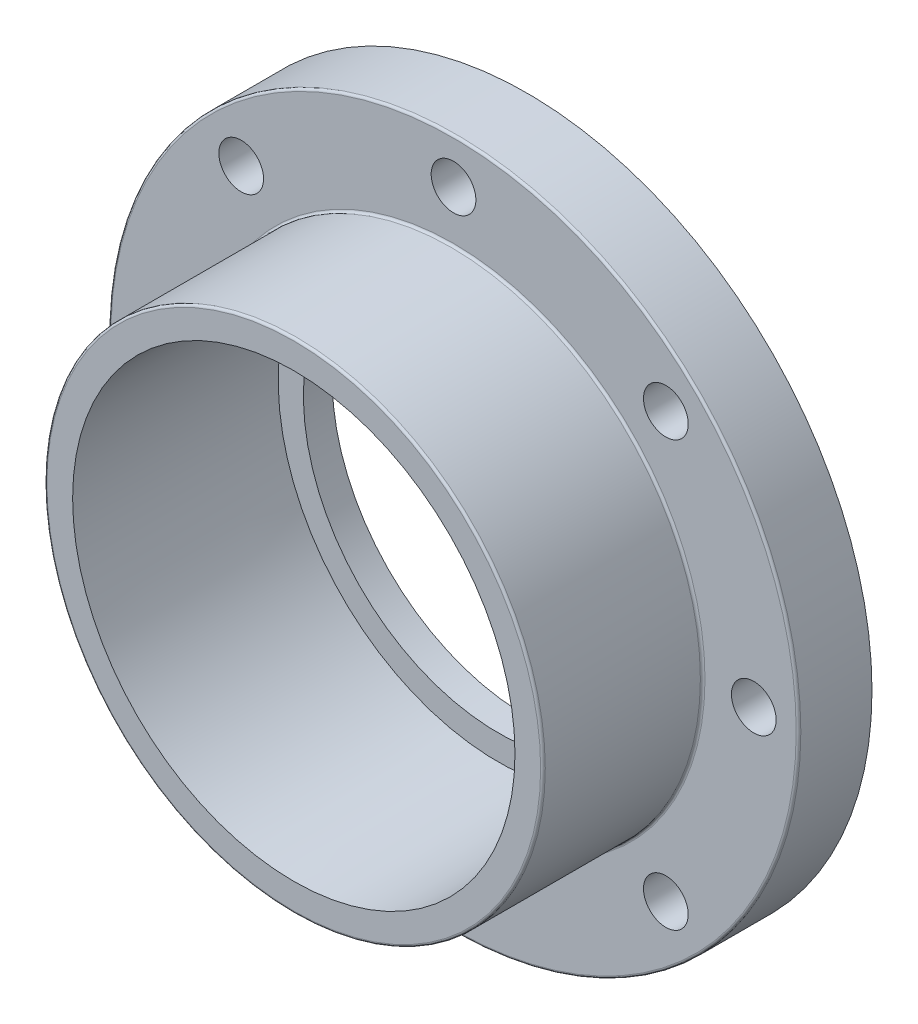
ISO-10303-21;
HEADER;
FILE_DESCRIPTION(('STEP AP214'),'2;1');
FILE_NAME('part.step','',(''),(''),'','','');
FILE_SCHEMA(('AUTOMOTIVE_DESIGN { 1 0 10303 214 1 1 1 1 }'));
ENDSEC;
DATA;
#1=APPLICATION_CONTEXT('core data for automotive mechanical design processes');
#2=APPLICATION_PROTOCOL_DEFINITION('international standard','automotive_design',2000,#1);
#3=PRODUCT_CONTEXT('',#1,'mechanical');
#4=PRODUCT('Part','Part','',(#3));
#5=PRODUCT_RELATED_PRODUCT_CATEGORY('part','',(#4));
#6=PRODUCT_DEFINITION_FORMATION('','',#4);
#7=PRODUCT_DEFINITION_CONTEXT('part definition',#1,'design');
#8=PRODUCT_DEFINITION('design','',#6,#7);
#9=PRODUCT_DEFINITION_SHAPE('','',#8);
#10=(LENGTH_UNIT() NAMED_UNIT(*) SI_UNIT(.MILLI.,.METRE.));
#11=(NAMED_UNIT(*) PLANE_ANGLE_UNIT() SI_UNIT($,.RADIAN.));
#12=(NAMED_UNIT(*) SI_UNIT($,.STERADIAN.) SOLID_ANGLE_UNIT());
#13=UNCERTAINTY_MEASURE_WITH_UNIT(LENGTH_MEASURE(1.E-05),#10,'distance_accuracy_value','');
#14=(GEOMETRIC_REPRESENTATION_CONTEXT(3) GLOBAL_UNCERTAINTY_ASSIGNED_CONTEXT((#13)) GLOBAL_UNIT_ASSIGNED_CONTEXT((#10,
#11,#12)) REPRESENTATION_CONTEXT('',''));
#15=CARTESIAN_POINT('',(0.,0.,0.));
#16=DIRECTION('',(0.,0.,1.));
#17=DIRECTION('',(1.,0.,0.));
#18=AXIS2_PLACEMENT_3D('',#15,#16,#17);
#19=CARTESIAN_POINT('',(0.,0.,36.5125));
#20=DIRECTION('',(0.,0.,1.));
#21=DIRECTION('',(1.,0.,0.));
#22=AXIS2_PLACEMENT_3D('',#19,#20,#21);
#23=PLANE('',#22);
#24=CARTESIAN_POINT('',(0.,0.,36.5125));
#25=DIRECTION('',(0.,0.,1.));
#26=DIRECTION('',(1.,0.,0.));
#27=AXIS2_PLACEMENT_3D('',#24,#25,#26);
#28=CIRCLE('',#27,124.979545454545);
#29=CARTESIAN_POINT('',(124.979545454545,0.,36.5125));
#30=VERTEX_POINT('',#29);
#31=EDGE_CURVE('E41',#30,#30,#28,.F.);
#32=ORIENTED_EDGE('',*,*,#31,.T.);
#33=EDGE_LOOP('',(#32));
#34=FACE_BOUND('',#33,.T.);
#35=CARTESIAN_POINT('',(0.,0.,36.5125));
#36=DIRECTION('',(0.,0.,1.));
#37=DIRECTION('',(1.,0.,0.));
#38=AXIS2_PLACEMENT_3D('',#35,#36,#37);
#39=CIRCLE('',#38,170.295454545455);
#40=CARTESIAN_POINT('',(170.295454545455,0.,36.5125));
#41=VERTEX_POINT('',#40);
#42=EDGE_CURVE('E45',#41,#41,#39,.T.);
#43=ORIENTED_EDGE('',*,*,#42,.T.);
#44=EDGE_LOOP('',(#43));
#45=FACE_BOUND('',#44,.T.);
#46=CARTESIAN_POINT('',(105.518009422561,105.518009422564,36.5125));
#47=DIRECTION('',(0.,0.,1.));
#48=DIRECTION('',(0.707106781186556,-0.707106781186539,0.));
#49=AXIS2_PLACEMENT_3D('',#46,#47,#48);
#50=CIRCLE('',#49,11.1125);
#51=CARTESIAN_POINT('',(113.375733528497,97.6602853166284,36.5125));
#52=VERTEX_POINT('',#51);
#53=EDGE_CURVE('E106',#52,#52,#50,.T.);
#54=ORIENTED_EDGE('',*,*,#53,.F.);
#55=EDGE_LOOP('',(#54));
#56=FACE_BOUND('',#55,.T.);
#57=CARTESIAN_POINT('',(149.225,1.5630489083666E-12,36.5125));
#58=DIRECTION('',(0.,0.,1.));
#59=DIRECTION('',(0.,-1.,0.));
#60=AXIS2_PLACEMENT_3D('',#57,#58,#59);
#61=CIRCLE('',#60,11.1125);
#62=CARTESIAN_POINT('',(149.225,-11.1124999999984,36.5125));
#63=VERTEX_POINT('',#62);
#64=EDGE_CURVE('E100',#63,#63,#61,.T.);
#65=ORIENTED_EDGE('',*,*,#64,.F.);
#66=EDGE_LOOP('',(#65));
#67=FACE_BOUND('',#66,.T.);
#68=CARTESIAN_POINT('',(105.518009422563,-105.518009422562,36.5125));
#69=DIRECTION('',(0.,0.,1.));
#70=DIRECTION('',(-0.707106781186541,-0.707106781186554,0.));
#71=AXIS2_PLACEMENT_3D('',#68,#69,#70);
#72=CIRCLE('',#71,11.1125);
#73=CARTESIAN_POINT('',(97.660285316628,-113.375733528497,36.5125));
#74=VERTEX_POINT('',#73);
#75=EDGE_CURVE('E94',#74,#74,#72,.T.);
#76=ORIENTED_EDGE('',*,*,#75,.F.);
#77=EDGE_LOOP('',(#76));
#78=FACE_BOUND('',#77,.T.);
#79=CARTESIAN_POINT('',(1.04203260557773E-12,-149.225,36.5125));
#80=DIRECTION('',(0.,0.,1.));
#81=DIRECTION('',(-1.,0.,0.));
#82=AXIS2_PLACEMENT_3D('',#79,#80,#81);
#83=CIRCLE('',#82,11.1125);
#84=CARTESIAN_POINT('',(-11.112499999999,-149.225,36.5125));
#85=VERTEX_POINT('',#84);
#86=EDGE_CURVE('E88',#85,#85,#83,.T.);
#87=ORIENTED_EDGE('',*,*,#86,.F.);
#88=EDGE_LOOP('',(#87));
#89=FACE_BOUND('',#88,.T.);
#90=CARTESIAN_POINT('',(-105.518009422562,-105.518009422563,36.5125));
#91=DIRECTION('',(0.,0.,1.));
#92=DIRECTION('',(-0.707106781186551,0.707106781186544,0.));
#93=AXIS2_PLACEMENT_3D('',#90,#91,#92);
#94=CIRCLE('',#93,11.1125);
#95=CARTESIAN_POINT('',(-113.375733528498,-97.6602853166276,36.5125));
#96=VERTEX_POINT('',#95);
#97=EDGE_CURVE('E82',#96,#96,#94,.T.);
#98=ORIENTED_EDGE('',*,*,#97,.F.);
#99=EDGE_LOOP('',(#98));
#100=FACE_BOUND('',#99,.T.);
#101=CARTESIAN_POINT('',(-149.225,-5.21016302788867E-13,36.5125));
#102=DIRECTION('',(0.,0.,1.));
#103=DIRECTION('',(0.,1.,0.));
#104=AXIS2_PLACEMENT_3D('',#101,#102,#103);
#105=CIRCLE('',#104,11.1125);
#106=CARTESIAN_POINT('',(-149.225,11.1124999999995,36.5125));
#107=VERTEX_POINT('',#106);
#108=EDGE_CURVE('E76',#107,#107,#105,.T.);
#109=ORIENTED_EDGE('',*,*,#108,.F.);
#110=EDGE_LOOP('',(#109));
#111=FACE_BOUND('',#110,.T.);
#112=CARTESIAN_POINT('',(-105.518009422563,105.518009422562,36.5125));
#113=DIRECTION('',(0.,0.,1.));
#114=DIRECTION('',(0.707106781186546,0.707106781186549,0.));
#115=AXIS2_PLACEMENT_3D('',#112,#113,#114);
#116=CIRCLE('',#115,11.1125);
#117=CARTESIAN_POINT('',(-97.6602853166273,113.375733528498,36.5125));
#118=VERTEX_POINT('',#117);
#119=EDGE_CURVE('E70',#118,#118,#116,.T.);
#120=ORIENTED_EDGE('',*,*,#119,.F.);
#121=EDGE_LOOP('',(#120));
#122=FACE_BOUND('',#121,.T.);
#123=CARTESIAN_POINT('',(0.,149.225,36.5125));
#124=DIRECTION('',(0.,0.,1.));
#125=DIRECTION('',(1.,0.,0.));
#126=AXIS2_PLACEMENT_3D('',#123,#124,#125);
#127=CIRCLE('',#126,11.1125);
#128=CARTESIAN_POINT('',(11.1125,149.225,36.5125));
#129=VERTEX_POINT('',#128);
#130=EDGE_CURVE('E64',#129,#129,#127,.T.);
#131=ORIENTED_EDGE('',*,*,#130,.F.);
#132=EDGE_LOOP('',(#131));
#133=FACE_BOUND('',#132,.T.);
#134=ADVANCED_FACE('F34',(#34,#45,#56,#67,#78,#89,#100,#111,#122,#133),#23,.T.);
#135=CARTESIAN_POINT('',(0.,0.,36.5125));
#136=DIRECTION('',(0.,0.,-1.));
#137=DIRECTION('',(-1.,0.,0.));
#138=AXIS2_PLACEMENT_3D('',#135,#136,#137);
#139=CYLINDRICAL_SURFACE('',#138,171.45);
#140=CARTESIAN_POINT('',(0.,0.,35.3579545454545));
#141=DIRECTION('',(0.,0.,1.));
#142=DIRECTION('',(1.,0.,0.));
#143=AXIS2_PLACEMENT_3D('',#140,#141,#142);
#144=CIRCLE('',#143,171.45);
#145=CARTESIAN_POINT('',(171.45,0.,35.3579545454545));
#146=VERTEX_POINT('',#145);
#147=EDGE_CURVE('E10',#146,#146,#144,.F.);
#148=ORIENTED_EDGE('',*,*,#147,.T.);
#149=EDGE_LOOP('',(#148));
#150=FACE_BOUND('',#149,.T.);
#151=CARTESIAN_POINT('',(0.,0.,0.));
#152=DIRECTION('',(0.,0.,1.));
#153=DIRECTION('',(1.,0.,0.));
#154=AXIS2_PLACEMENT_3D('',#151,#152,#153);
#155=CIRCLE('',#154,171.45);
#156=CARTESIAN_POINT('',(171.45,0.,0.));
#157=VERTEX_POINT('',#156);
#158=EDGE_CURVE('E60',#157,#157,#155,.T.);
#159=ORIENTED_EDGE('',*,*,#158,.T.);
#160=EDGE_LOOP('',(#159));
#161=FACE_BOUND('',#160,.T.);
#162=ADVANCED_FACE('F130',(#150,#161),#139,.T.);
#163=CARTESIAN_POINT('',(0.,0.,0.));
#164=DIRECTION('',(0.,0.,1.));
#165=DIRECTION('',(1.,0.,0.));
#166=AXIS2_PLACEMENT_3D('',#163,#164,#165);
#167=PLANE('',#166);
#168=CARTESIAN_POINT('',(0.,0.,0.));
#169=DIRECTION('',(0.,0.,-1.));
#170=DIRECTION('',(0.,1.,0.));
#171=AXIS2_PLACEMENT_3D('',#168,#169,#170);
#172=CIRCLE('',#171,96.8375);
#173=CARTESIAN_POINT('',(0.,96.8375,0.));
#174=VERTEX_POINT('',#173);
#175=EDGE_CURVE('E120',#174,#174,#172,.T.);
#176=ORIENTED_EDGE('',*,*,#175,.F.);
#177=EDGE_LOOP('',(#176));
#178=FACE_BOUND('',#177,.T.);
#179=CARTESIAN_POINT('',(105.518009422561,105.518009422564,0.));
#180=DIRECTION('',(0.,0.,1.));
#181=DIRECTION('',(0.707106781186556,-0.707106781186539,0.));
#182=AXIS2_PLACEMENT_3D('',#179,#180,#181);
#183=CIRCLE('',#182,11.1125);
#184=CARTESIAN_POINT('',(113.375733528497,97.6602853166284,0.));
#185=VERTEX_POINT('',#184);
#186=EDGE_CURVE('E103',#185,#185,#183,.T.);
#187=ORIENTED_EDGE('',*,*,#186,.T.);
#188=EDGE_LOOP('',(#187));
#189=FACE_BOUND('',#188,.T.);
#190=CARTESIAN_POINT('',(149.225,1.5630489083666E-12,0.));
#191=DIRECTION('',(0.,0.,1.));
#192=DIRECTION('',(0.,-1.,0.));
#193=AXIS2_PLACEMENT_3D('',#190,#191,#192);
#194=CIRCLE('',#193,11.1125);
#195=CARTESIAN_POINT('',(149.225,-11.1124999999984,0.));
#196=VERTEX_POINT('',#195);
#197=EDGE_CURVE('E97',#196,#196,#194,.T.);
#198=ORIENTED_EDGE('',*,*,#197,.T.);
#199=EDGE_LOOP('',(#198));
#200=FACE_BOUND('',#199,.T.);
#201=CARTESIAN_POINT('',(105.518009422563,-105.518009422562,0.));
#202=DIRECTION('',(0.,0.,1.));
#203=DIRECTION('',(-0.707106781186541,-0.707106781186554,0.));
#204=AXIS2_PLACEMENT_3D('',#201,#202,#203);
#205=CIRCLE('',#204,11.1125);
#206=CARTESIAN_POINT('',(97.660285316628,-113.375733528497,0.));
#207=VERTEX_POINT('',#206);
#208=EDGE_CURVE('E91',#207,#207,#205,.T.);
#209=ORIENTED_EDGE('',*,*,#208,.T.);
#210=EDGE_LOOP('',(#209));
#211=FACE_BOUND('',#210,.T.);
#212=CARTESIAN_POINT('',(1.04203260557773E-12,-149.225,0.));
#213=DIRECTION('',(0.,0.,1.));
#214=DIRECTION('',(-1.,0.,0.));
#215=AXIS2_PLACEMENT_3D('',#212,#213,#214);
#216=CIRCLE('',#215,11.1125);
#217=CARTESIAN_POINT('',(-11.112499999999,-149.225,0.));
#218=VERTEX_POINT('',#217);
#219=EDGE_CURVE('E85',#218,#218,#216,.T.);
#220=ORIENTED_EDGE('',*,*,#219,.T.);
#221=EDGE_LOOP('',(#220));
#222=FACE_BOUND('',#221,.T.);
#223=CARTESIAN_POINT('',(-105.518009422562,-105.518009422563,0.));
#224=DIRECTION('',(0.,0.,1.));
#225=DIRECTION('',(-0.707106781186551,0.707106781186544,0.));
#226=AXIS2_PLACEMENT_3D('',#223,#224,#225);
#227=CIRCLE('',#226,11.1125);
#228=CARTESIAN_POINT('',(-113.375733528498,-97.6602853166276,0.));
#229=VERTEX_POINT('',#228);
#230=EDGE_CURVE('E79',#229,#229,#227,.T.);
#231=ORIENTED_EDGE('',*,*,#230,.T.);
#232=EDGE_LOOP('',(#231));
#233=FACE_BOUND('',#232,.T.);
#234=CARTESIAN_POINT('',(-149.225,-5.21016302788867E-13,0.));
#235=DIRECTION('',(0.,0.,1.));
#236=DIRECTION('',(0.,1.,0.));
#237=AXIS2_PLACEMENT_3D('',#234,#235,#236);
#238=CIRCLE('',#237,11.1125);
#239=CARTESIAN_POINT('',(-149.225,11.1124999999995,0.));
#240=VERTEX_POINT('',#239);
#241=EDGE_CURVE('E73',#240,#240,#238,.T.);
#242=ORIENTED_EDGE('',*,*,#241,.T.);
#243=EDGE_LOOP('',(#242));
#244=FACE_BOUND('',#243,.T.);
#245=CARTESIAN_POINT('',(-105.518009422563,105.518009422562,0.));
#246=DIRECTION('',(0.,0.,1.));
#247=DIRECTION('',(0.707106781186546,0.707106781186549,0.));
#248=AXIS2_PLACEMENT_3D('',#245,#246,#247);
#249=CIRCLE('',#248,11.1125);
#250=CARTESIAN_POINT('',(-97.6602853166273,113.375733528498,0.));
#251=VERTEX_POINT('',#250);
#252=EDGE_CURVE('E67',#251,#251,#249,.T.);
#253=ORIENTED_EDGE('',*,*,#252,.T.);
#254=EDGE_LOOP('',(#253));
#255=FACE_BOUND('',#254,.T.);
#256=CARTESIAN_POINT('',(0.,149.225,0.));
#257=DIRECTION('',(0.,0.,1.));
#258=DIRECTION('',(1.,0.,0.));
#259=AXIS2_PLACEMENT_3D('',#256,#257,#258);
#260=CIRCLE('',#259,11.1125);
#261=CARTESIAN_POINT('',(11.1125,149.225,0.));
#262=VERTEX_POINT('',#261);
#263=EDGE_CURVE('E63',#262,#262,#260,.T.);
#264=ORIENTED_EDGE('',*,*,#263,.T.);
#265=EDGE_LOOP('',(#264));
#266=FACE_BOUND('',#265,.T.);
#267=ORIENTED_EDGE('',*,*,#158,.F.);
#268=EDGE_LOOP('',(#267));
#269=FACE_BOUND('',#268,.T.);
#270=ADVANCED_FACE('F126',(#178,#189,#200,#211,#222,#233,#244,#255,#266,#269),#167,.F.);
#271=CARTESIAN_POINT('',(0.,0.,115.8875));
#272=DIRECTION('',(0.,0.,-1.));
#273=DIRECTION('',(-1.,0.,0.));
#274=AXIS2_PLACEMENT_3D('',#271,#272,#273);
#275=CYLINDRICAL_SURFACE('',#274,123.825);
#276=CARTESIAN_POINT('',(0.,0.,114.732954545455));
#277=DIRECTION('',(0.,0.,1.));
#278=DIRECTION('',(1.,0.,0.));
#279=AXIS2_PLACEMENT_3D('',#276,#277,#278);
#280=CIRCLE('',#279,123.825);
#281=CARTESIAN_POINT('',(-123.825,0.,114.732954545455));
#282=VERTEX_POINT('',#281);
#283=EDGE_CURVE('E49',#282,#282,#280,.F.);
#284=CARTESIAN_POINT('',(0.,0.,37.6670454545455));
#285=DIRECTION('',(0.,0.,1.));
#286=DIRECTION('',(1.,0.,0.));
#287=AXIS2_PLACEMENT_3D('',#284,#285,#286);
#288=CIRCLE('',#287,123.825);
#289=CARTESIAN_POINT('',(-123.825,0.,37.6670454545455));
#290=VERTEX_POINT('',#289);
#291=EDGE_CURVE('E54',#290,#290,#288,.T.);
#292=CARTESIAN_POINT('',(-123.825,0.,114.732954545455));
#293=CARTESIAN_POINT('',(-123.825,0.,113.930184659091));
#294=CARTESIAN_POINT('',(-123.825,0.,113.127414772727));
#295=CARTESIAN_POINT('',(-123.825,0.,111.521875));
#296=CARTESIAN_POINT('',(-123.825,0.,110.719105113636));
#297=CARTESIAN_POINT('',(-123.825,0.,109.113565340909));
#298=CARTESIAN_POINT('',(-123.825,0.,108.310795454545));
#299=CARTESIAN_POINT('',(-123.825,0.,106.705255681818));
#300=CARTESIAN_POINT('',(-123.825,0.,105.902485795455));
#301=CARTESIAN_POINT('',(-123.825,0.,104.296946022727));
#302=CARTESIAN_POINT('',(-123.825,0.,103.494176136364));
#303=CARTESIAN_POINT('',(-123.825,0.,101.888636363636));
#304=CARTESIAN_POINT('',(-123.825,0.,101.085866477273));
#305=CARTESIAN_POINT('',(-123.825,0.,99.4803267045455));
#306=CARTESIAN_POINT('',(-123.825,0.,98.6775568181818));
#307=CARTESIAN_POINT('',(-123.825,0.,97.0720170454546));
#308=CARTESIAN_POINT('',(-123.825,0.,96.2692471590909));
#309=CARTESIAN_POINT('',(-123.825,0.,94.6637073863636));
#310=CARTESIAN_POINT('',(-123.825,0.,93.8609375));
#311=CARTESIAN_POINT('',(-123.825,0.,92.2553977272727));
#312=CARTESIAN_POINT('',(-123.825,0.,91.4526278409091));
#313=CARTESIAN_POINT('',(-123.825,0.,89.8470880681818));
#314=CARTESIAN_POINT('',(-123.825,0.,89.0443181818182));
#315=CARTESIAN_POINT('',(-123.825,0.,87.4387784090909));
#316=CARTESIAN_POINT('',(-123.825,0.,86.6360085227273));
#317=CARTESIAN_POINT('',(-123.825,0.,85.03046875));
#318=CARTESIAN_POINT('',(-123.825,0.,84.2276988636364));
#319=CARTESIAN_POINT('',(-123.825,0.,82.6221590909091));
#320=CARTESIAN_POINT('',(-123.825,0.,81.8193892045455));
#321=CARTESIAN_POINT('',(-123.825,0.,80.2138494318182));
#322=CARTESIAN_POINT('',(-123.825,0.,79.4110795454546));
#323=CARTESIAN_POINT('',(-123.825,0.,77.8055397727273));
#324=CARTESIAN_POINT('',(-123.825,0.,77.0027698863636));
#325=CARTESIAN_POINT('',(-123.825,0.,75.3972301136364));
#326=CARTESIAN_POINT('',(-123.825,0.,74.5944602272727));
#327=CARTESIAN_POINT('',(-123.825,0.,72.9889204545455));
#328=CARTESIAN_POINT('',(-123.825,0.,72.1861505681818));
#329=CARTESIAN_POINT('',(-123.825,0.,70.5806107954545));
#330=CARTESIAN_POINT('',(-123.825,0.,69.7778409090909));
#331=CARTESIAN_POINT('',(-123.825,0.,68.1723011363636));
#332=CARTESIAN_POINT('',(-123.825,0.,67.36953125));
#333=CARTESIAN_POINT('',(-123.825,0.,65.7639914772727));
#334=CARTESIAN_POINT('',(-123.825,0.,64.9612215909091));
#335=CARTESIAN_POINT('',(-123.825,0.,63.3556818181818));
#336=CARTESIAN_POINT('',(-123.825,0.,62.5529119318182));
#337=CARTESIAN_POINT('',(-123.825,0.,60.9473721590909));
#338=CARTESIAN_POINT('',(-123.825,0.,60.1446022727273));
#339=CARTESIAN_POINT('',(-123.825,0.,58.5390625));
#340=CARTESIAN_POINT('',(-123.825,0.,57.7362926136364));
#341=CARTESIAN_POINT('',(-123.825,0.,56.1307528409091));
#342=CARTESIAN_POINT('',(-123.825,0.,55.3279829545455));
#343=CARTESIAN_POINT('',(-123.825,0.,53.7224431818182));
#344=CARTESIAN_POINT('',(-123.825,0.,52.9196732954545));
#345=CARTESIAN_POINT('',(-123.825,0.,51.3141335227273));
#346=CARTESIAN_POINT('',(-123.825,0.,50.5113636363636));
#347=CARTESIAN_POINT('',(-123.825,0.,48.9058238636364));
#348=CARTESIAN_POINT('',(-123.825,0.,48.1030539772727));
#349=CARTESIAN_POINT('',(-123.825,0.,46.4975142045455));
#350=CARTESIAN_POINT('',(-123.825,0.,45.6947443181818));
#351=CARTESIAN_POINT('',(-123.825,0.,44.0892045454545));
#352=CARTESIAN_POINT('',(-123.825,0.,43.2864346590909));
#353=CARTESIAN_POINT('',(-123.825,0.,41.6808948863637));
#354=CARTESIAN_POINT('',(-123.825,0.,40.878125));
#355=CARTESIAN_POINT('',(-123.825,0.,39.2725852272727));
#356=CARTESIAN_POINT('',(-123.825,0.,38.4698153409091));
#357=CARTESIAN_POINT('',(-123.825,0.,37.6670454545455));
#358=B_SPLINE_CURVE_WITH_KNOTS('',3,(#292,#293,#294,#295,#296,#297,#298,#299,#300,#301,#302,
#303,#304,#305,#306,#307,#308,#309,#310,#311,#312,#313,#314,#315,#316,#317,#318,#319,#320,#321,
#322,#323,#324,#325,#326,#327,#328,#329,#330,#331,#332,#333,#334,#335,#336,#337,#338,#339,#340,
#341,#342,#343,#344,#345,#346,#347,#348,#349,#350,#351,#352,#353,#354,#355,#356,#357),
.UNSPECIFIED.,.F.,.F.,(4,2,2,2,2,2,2,2,2,2,2,2,2,2,2,2,2,2,2,2,2,2,2,2,2,2,2,2,2,2,2,2,4),(0.,
2.40830965909092,4.81661931818182,7.22492897727274,9.63323863636364,12.0415482954545,
14.4498579545455,16.8581676136364,19.2664772727273,21.6747869318182,24.0830965909091,
26.49140625,28.8997159090909,31.3080255681818,33.7163352272727,36.1246448863636,
38.5329545454546,40.9412642045455,43.3495738636364,45.7578835227273,48.1661931818182,
50.5745028409091,52.9828125,55.3911221590909,57.7994318181818,60.2077414772727,62.6160511363637,
65.0243607954545,67.4326704545455,69.8409801136364,72.2492897727273,74.6575994318182,
77.0659090909091),.UNSPECIFIED.);
#359=EDGE_CURVE('BSEAM129',#282,#290,#358,.T.);
#360=ORIENTED_EDGE('',*,*,#283,.T.);
#361=ORIENTED_EDGE('',*,*,#291,.T.);
#362=ORIENTED_EDGE('',*,*,#359,.T.);
#363=ORIENTED_EDGE('',*,*,#359,.F.);
#364=EDGE_LOOP('',(#360,#362,#361,#363));
#365=FACE_BOUND('',#364,.T.);
#366=ADVANCED_FACE('F129',(#365),#275,.T.);
#367=CARTESIAN_POINT('',(0.,0.,115.8875));
#368=DIRECTION('',(0.,0.,1.));
#369=DIRECTION('',(1.,0.,0.));
#370=AXIS2_PLACEMENT_3D('',#367,#368,#369);
#371=PLANE('',#370);
#372=CARTESIAN_POINT('',(0.,0.,115.8875));
#373=DIRECTION('',(0.,0.,-1.));
#374=DIRECTION('',(0.,1.,0.));
#375=AXIS2_PLACEMENT_3D('',#372,#373,#374);
#376=CIRCLE('',#375,109.9185);
#377=CARTESIAN_POINT('',(0.,109.9185,115.8875));
#378=VERTEX_POINT('',#377);
#379=EDGE_CURVE('E109',#378,#378,#376,.T.);
#380=ORIENTED_EDGE('',*,*,#379,.T.);
#381=EDGE_LOOP('',(#380));
#382=FACE_BOUND('',#381,.T.);
#383=CARTESIAN_POINT('',(0.,0.,115.8875));
#384=DIRECTION('',(0.,0.,1.));
#385=DIRECTION('',(1.,0.,0.));
#386=AXIS2_PLACEMENT_3D('',#383,#384,#385);
#387=CIRCLE('',#386,122.670454545455);
#388=CARTESIAN_POINT('',(122.670454545455,0.,115.8875));
#389=VERTEX_POINT('',#388);
#390=EDGE_CURVE('E57',#389,#389,#387,.T.);
#391=ORIENTED_EDGE('',*,*,#390,.T.);
#392=EDGE_LOOP('',(#391));
#393=FACE_BOUND('',#392,.T.);
#394=ADVANCED_FACE('F173',(#382,#393),#371,.T.);
#395=CARTESIAN_POINT('',(0.,149.225,0.));
#396=DIRECTION('',(0.,0.,1.));
#397=DIRECTION('',(1.,0.,0.));
#398=AXIS2_PLACEMENT_3D('',#395,#396,#397);
#399=CYLINDRICAL_SURFACE('',#398,11.1125);
#400=ORIENTED_EDGE('',*,*,#263,.F.);
#401=EDGE_LOOP('',(#400));
#402=FACE_BOUND('',#401,.T.);
#403=ORIENTED_EDGE('',*,*,#130,.T.);
#404=EDGE_LOOP('',(#403));
#405=FACE_BOUND('',#404,.T.);
#406=ADVANCED_FACE('F179',(#402,#405),#399,.F.);
#407=CARTESIAN_POINT('',(-105.518009422563,105.518009422562,0.));
#408=DIRECTION('',(0.,0.,1.));
#409=DIRECTION('',(1.,0.,0.));
#410=AXIS2_PLACEMENT_3D('',#407,#408,#409);
#411=CYLINDRICAL_SURFACE('',#410,11.1125);
#412=ORIENTED_EDGE('',*,*,#252,.F.);
#413=EDGE_LOOP('',(#412));
#414=FACE_BOUND('',#413,.T.);
#415=ORIENTED_EDGE('',*,*,#119,.T.);
#416=EDGE_LOOP('',(#415));
#417=FACE_BOUND('',#416,.T.);
#418=ADVANCED_FACE('F185',(#414,#417),#411,.F.);
#419=CARTESIAN_POINT('',(-149.225,-5.21016302788867E-13,0.));
#420=DIRECTION('',(0.,0.,1.));
#421=DIRECTION('',(1.,0.,0.));
#422=AXIS2_PLACEMENT_3D('',#419,#420,#421);
#423=CYLINDRICAL_SURFACE('',#422,11.1125);
#424=ORIENTED_EDGE('',*,*,#241,.F.);
#425=EDGE_LOOP('',(#424));
#426=FACE_BOUND('',#425,.T.);
#427=ORIENTED_EDGE('',*,*,#108,.T.);
#428=EDGE_LOOP('',(#427));
#429=FACE_BOUND('',#428,.T.);
#430=ADVANCED_FACE('F189',(#426,#429),#423,.F.);
#431=CARTESIAN_POINT('',(-105.518009422562,-105.518009422563,0.));
#432=DIRECTION('',(0.,0.,1.));
#433=DIRECTION('',(1.,0.,0.));
#434=AXIS2_PLACEMENT_3D('',#431,#432,#433);
#435=CYLINDRICAL_SURFACE('',#434,11.1125);
#436=ORIENTED_EDGE('',*,*,#230,.F.);
#437=EDGE_LOOP('',(#436));
#438=FACE_BOUND('',#437,.T.);
#439=ORIENTED_EDGE('',*,*,#97,.T.);
#440=EDGE_LOOP('',(#439));
#441=FACE_BOUND('',#440,.T.);
#442=ADVANCED_FACE('F193',(#438,#441),#435,.F.);
#443=CARTESIAN_POINT('',(1.04203260557773E-12,-149.225,0.));
#444=DIRECTION('',(0.,0.,1.));
#445=DIRECTION('',(1.,0.,0.));
#446=AXIS2_PLACEMENT_3D('',#443,#444,#445);
#447=CYLINDRICAL_SURFACE('',#446,11.1125);
#448=ORIENTED_EDGE('',*,*,#219,.F.);
#449=EDGE_LOOP('',(#448));
#450=FACE_BOUND('',#449,.T.);
#451=ORIENTED_EDGE('',*,*,#86,.T.);
#452=EDGE_LOOP('',(#451));
#453=FACE_BOUND('',#452,.T.);
#454=ADVANCED_FACE('F197',(#450,#453),#447,.F.);
#455=CARTESIAN_POINT('',(105.518009422563,-105.518009422562,0.));
#456=DIRECTION('',(0.,0.,1.));
#457=DIRECTION('',(1.,0.,0.));
#458=AXIS2_PLACEMENT_3D('',#455,#456,#457);
#459=CYLINDRICAL_SURFACE('',#458,11.1125);
#460=ORIENTED_EDGE('',*,*,#208,.F.);
#461=EDGE_LOOP('',(#460));
#462=FACE_BOUND('',#461,.T.);
#463=ORIENTED_EDGE('',*,*,#75,.T.);
#464=EDGE_LOOP('',(#463));
#465=FACE_BOUND('',#464,.T.);
#466=ADVANCED_FACE('F201',(#462,#465),#459,.F.);
#467=CARTESIAN_POINT('',(149.225,1.5630489083666E-12,0.));
#468=DIRECTION('',(0.,0.,1.));
#469=DIRECTION('',(1.,0.,0.));
#470=AXIS2_PLACEMENT_3D('',#467,#468,#469);
#471=CYLINDRICAL_SURFACE('',#470,11.1125);
#472=ORIENTED_EDGE('',*,*,#197,.F.);
#473=EDGE_LOOP('',(#472));
#474=FACE_BOUND('',#473,.T.);
#475=ORIENTED_EDGE('',*,*,#64,.T.);
#476=EDGE_LOOP('',(#475));
#477=FACE_BOUND('',#476,.T.);
#478=ADVANCED_FACE('F205',(#474,#477),#471,.F.);
#479=CARTESIAN_POINT('',(105.518009422561,105.518009422564,0.));
#480=DIRECTION('',(0.,0.,1.));
#481=DIRECTION('',(1.,0.,0.));
#482=AXIS2_PLACEMENT_3D('',#479,#480,#481);
#483=CYLINDRICAL_SURFACE('',#482,11.1125);
#484=ORIENTED_EDGE('',*,*,#186,.F.);
#485=EDGE_LOOP('',(#484));
#486=FACE_BOUND('',#485,.T.);
#487=ORIENTED_EDGE('',*,*,#53,.T.);
#488=EDGE_LOOP('',(#487));
#489=FACE_BOUND('',#488,.T.);
#490=ADVANCED_FACE('F160',(#486,#489),#483,.F.);
#491=CARTESIAN_POINT('',(0.,0.,114.732954545455));
#492=DIRECTION('',(0.,0.,1.));
#493=DIRECTION('',(1.,0.,0.));
#494=AXIS2_PLACEMENT_3D('',#491,#492,#493);
#495=TOROIDAL_SURFACE('',#494,122.670454545455,1.15454545454545);
#496=ORIENTED_EDGE('',*,*,#283,.F.);
#497=EDGE_LOOP('',(#496));
#498=FACE_BOUND('',#497,.T.);
#499=ORIENTED_EDGE('',*,*,#390,.F.);
#500=EDGE_LOOP('',(#499));
#501=FACE_BOUND('',#500,.T.);
#502=ADVANCED_FACE('F157',(#498,#501),#495,.T.);
#503=CARTESIAN_POINT('',(0.,0.,37.6670454545455));
#504=DIRECTION('',(0.,0.,1.));
#505=DIRECTION('',(1.,0.,0.));
#506=AXIS2_PLACEMENT_3D('',#503,#504,#505);
#507=TOROIDAL_SURFACE('',#506,124.979545454545,1.15454545454545);
#508=ORIENTED_EDGE('',*,*,#31,.F.);
#509=EDGE_LOOP('',(#508));
#510=FACE_BOUND('',#509,.T.);
#511=ORIENTED_EDGE('',*,*,#291,.F.);
#512=EDGE_LOOP('',(#511));
#513=FACE_BOUND('',#512,.T.);
#514=ADVANCED_FACE('F159',(#510,#513),#507,.F.);
#515=CARTESIAN_POINT('',(0.,0.,35.3579545454545));
#516=DIRECTION('',(0.,0.,1.));
#517=DIRECTION('',(1.,0.,0.));
#518=AXIS2_PLACEMENT_3D('',#515,#516,#517);
#519=TOROIDAL_SURFACE('',#518,170.295454545455,1.15454545454545);
#520=ORIENTED_EDGE('',*,*,#147,.F.);
#521=EDGE_LOOP('',(#520));
#522=FACE_BOUND('',#521,.T.);
#523=ORIENTED_EDGE('',*,*,#42,.F.);
#524=EDGE_LOOP('',(#523));
#525=FACE_BOUND('',#524,.T.);
#526=ADVANCED_FACE('F36',(#522,#525),#519,.T.);
#527=CARTESIAN_POINT('',(0.,0.,14.2875));
#528=DIRECTION('',(0.,0.,1.));
#529=DIRECTION('',(0.,-1.,0.));
#530=AXIS2_PLACEMENT_3D('',#527,#528,#529);
#531=CONICAL_SURFACE('',#530,109.347,0.00562494067495453);
#532=ORIENTED_EDGE('',*,*,#379,.F.);
#533=EDGE_LOOP('',(#532));
#534=FACE_BOUND('',#533,.T.);
#535=CARTESIAN_POINT('',(0.,0.,14.2875));
#536=DIRECTION('',(0.,0.,-1.));
#537=DIRECTION('',(0.,1.,0.));
#538=AXIS2_PLACEMENT_3D('',#535,#536,#537);
#539=CIRCLE('',#538,109.347);
#540=CARTESIAN_POINT('',(0.,109.347,14.2875));
#541=VERTEX_POINT('',#540);
#542=EDGE_CURVE('E114',#541,#541,#539,.T.);
#543=ORIENTED_EDGE('',*,*,#542,.T.);
#544=EDGE_LOOP('',(#543));
#545=FACE_BOUND('',#544,.T.);
#546=ADVANCED_FACE('F167',(#534,#545),#531,.F.);
#547=CARTESIAN_POINT('',(0.,109.347,14.2875));
#548=DIRECTION('',(0.,0.,-1.));
#549=DIRECTION('',(0.,1.,0.));
#550=AXIS2_PLACEMENT_3D('',#547,#548,#549);
#551=PLANE('',#550);
#552=ORIENTED_EDGE('',*,*,#542,.F.);
#553=EDGE_LOOP('',(#552));
#554=FACE_BOUND('',#553,.T.);
#555=CARTESIAN_POINT('',(0.,0.,14.2875));
#556=DIRECTION('',(0.,0.,-1.));
#557=DIRECTION('',(0.,1.,0.));
#558=AXIS2_PLACEMENT_3D('',#555,#556,#557);
#559=CIRCLE('',#558,96.8375);
#560=CARTESIAN_POINT('',(0.,96.8375,14.2875));
#561=VERTEX_POINT('',#560);
#562=EDGE_CURVE('E117',#561,#561,#559,.T.);
#563=ORIENTED_EDGE('',*,*,#562,.T.);
#564=EDGE_LOOP('',(#563));
#565=FACE_BOUND('',#564,.T.);
#566=ADVANCED_FACE('F215',(#554,#565),#551,.F.);
#567=CARTESIAN_POINT('',(0.,0.,0.));
#568=DIRECTION('',(0.,0.,-1.));
#569=DIRECTION('',(0.,1.,0.));
#570=AXIS2_PLACEMENT_3D('',#567,#568,#569);
#571=CYLINDRICAL_SURFACE('',#570,96.8375);
#572=ORIENTED_EDGE('',*,*,#562,.F.);
#573=EDGE_LOOP('',(#572));
#574=FACE_BOUND('',#573,.T.);
#575=ORIENTED_EDGE('',*,*,#175,.T.);
#576=EDGE_LOOP('',(#575));
#577=FACE_BOUND('',#576,.T.);
#578=ADVANCED_FACE('F124',(#574,#577),#571,.F.);
#579=CLOSED_SHELL('',(#134,#162,#270,#366,#394,#406,#418,#430,#442,#454,#466,#478,#490,#502,
#514,#526,#546,#566,#578));
#580=MANIFOLD_SOLID_BREP('B2',#579);
#581=ADVANCED_BREP_SHAPE_REPRESENTATION('',(#18,#580),#14);
#582=SHAPE_DEFINITION_REPRESENTATION(#9,#581);
ENDSEC;
END-ISO-10303-21;
